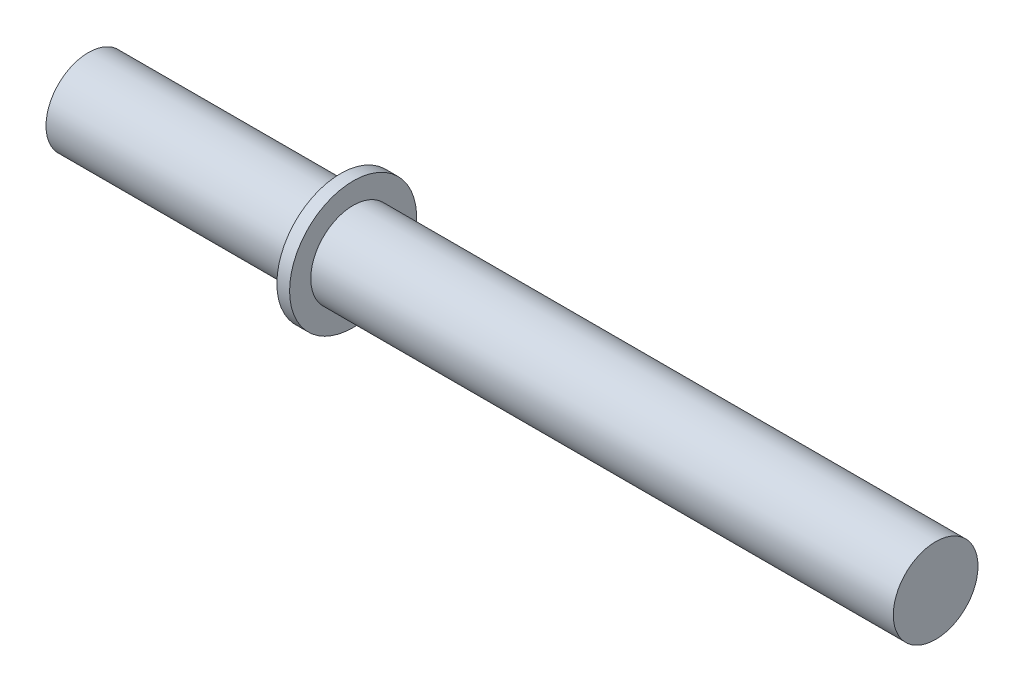
ISO-10303-21;
HEADER;
FILE_DESCRIPTION(('STEP AP214'),'2;1');
FILE_NAME('part.step','',(''),(''),'','','');
FILE_SCHEMA(('AUTOMOTIVE_DESIGN { 1 0 10303 214 1 1 1 1 }'));
ENDSEC;
DATA;
#1=APPLICATION_CONTEXT('core data for automotive mechanical design processes');
#2=APPLICATION_PROTOCOL_DEFINITION('international standard','automotive_design',2000,#1);
#3=PRODUCT_CONTEXT('',#1,'mechanical');
#4=PRODUCT('Part','Part','',(#3));
#5=PRODUCT_RELATED_PRODUCT_CATEGORY('part','',(#4));
#6=PRODUCT_DEFINITION_FORMATION('','',#4);
#7=PRODUCT_DEFINITION_CONTEXT('part definition',#1,'design');
#8=PRODUCT_DEFINITION('design','',#6,#7);
#9=PRODUCT_DEFINITION_SHAPE('','',#8);
#10=(LENGTH_UNIT() NAMED_UNIT(*) SI_UNIT(.MILLI.,.METRE.));
#11=(NAMED_UNIT(*) PLANE_ANGLE_UNIT() SI_UNIT($,.RADIAN.));
#12=(NAMED_UNIT(*) SI_UNIT($,.STERADIAN.) SOLID_ANGLE_UNIT());
#13=UNCERTAINTY_MEASURE_WITH_UNIT(LENGTH_MEASURE(1.E-05),#10,'distance_accuracy_value','');
#14=(GEOMETRIC_REPRESENTATION_CONTEXT(3) GLOBAL_UNCERTAINTY_ASSIGNED_CONTEXT((#13)) GLOBAL_UNIT_ASSIGNED_CONTEXT((#10,
#11,#12)) REPRESENTATION_CONTEXT('',''));
#15=CARTESIAN_POINT('',(0.,0.,0.));
#16=DIRECTION('',(0.,0.,1.));
#17=DIRECTION('',(1.,0.,0.));
#18=AXIS2_PLACEMENT_3D('',#15,#16,#17);
#19=CARTESIAN_POINT('',(200.,0.,0.));
#20=DIRECTION('',(-1.,0.,0.));
#21=DIRECTION('',(0.,0.,1.));
#22=AXIS2_PLACEMENT_3D('',#19,#20,#21);
#23=CYLINDRICAL_SURFACE('',#22,10.);
#24=CARTESIAN_POINT('',(59.5,0.,0.));
#25=DIRECTION('',(-1.,0.,0.));
#26=DIRECTION('',(0.,0.,1.));
#27=AXIS2_PLACEMENT_3D('',#24,#25,#26);
#28=CIRCLE('',#27,10.);
#29=CARTESIAN_POINT('',(59.5,0.,10.));
#30=VERTEX_POINT('',#29);
#31=EDGE_CURVE('E40',#30,#30,#28,.T.);
#32=ORIENTED_EDGE('',*,*,#31,.T.);
#33=EDGE_LOOP('',(#32));
#34=FACE_BOUND('',#33,.T.);
#35=CARTESIAN_POINT('',(0.,0.,0.));
#36=DIRECTION('',(1.,0.,0.));
#37=DIRECTION('',(0.,0.,-1.));
#38=AXIS2_PLACEMENT_3D('',#35,#36,#37);
#39=CIRCLE('',#38,10.);
#40=CARTESIAN_POINT('',(0.,0.,-10.));
#41=VERTEX_POINT('',#40);
#42=EDGE_CURVE('E50',#41,#41,#39,.T.);
#43=ORIENTED_EDGE('',*,*,#42,.T.);
#44=EDGE_LOOP('',(#43));
#45=FACE_BOUND('',#44,.T.);
#46=ADVANCED_FACE('F37',(#34,#45),#23,.T.);
#47=CARTESIAN_POINT('',(0.,0.,0.));
#48=DIRECTION('',(1.,0.,0.));
#49=DIRECTION('',(0.,0.,-1.));
#50=AXIS2_PLACEMENT_3D('',#47,#48,#49);
#51=PLANE('',#50);
#52=ORIENTED_EDGE('',*,*,#42,.F.);
#53=EDGE_LOOP('',(#52));
#54=FACE_BOUND('',#53,.T.);
#55=ADVANCED_FACE('F82',(#54),#51,.F.);
#56=CARTESIAN_POINT('',(59.5,0.,0.));
#57=DIRECTION('',(1.,0.,0.));
#58=DIRECTION('',(0.,0.,-1.));
#59=AXIS2_PLACEMENT_3D('',#56,#57,#58);
#60=CYLINDRICAL_SURFACE('',#59,15.);
#61=CARTESIAN_POINT('',(59.5,0.,0.));
#62=DIRECTION('',(-1.,0.,0.));
#63=DIRECTION('',(0.,0.,1.));
#64=AXIS2_PLACEMENT_3D('',#61,#62,#63);
#65=CIRCLE('',#64,15.);
#66=CARTESIAN_POINT('',(59.5,0.,15.));
#67=VERTEX_POINT('',#66);
#68=EDGE_CURVE('E60',#67,#67,#65,.T.);
#69=ORIENTED_EDGE('',*,*,#68,.F.);
#70=EDGE_LOOP('',(#69));
#71=FACE_BOUND('',#70,.T.);
#72=CARTESIAN_POINT('',(62.5,0.,0.));
#73=DIRECTION('',(-1.,0.,0.));
#74=DIRECTION('',(0.,0.,1.));
#75=AXIS2_PLACEMENT_3D('',#72,#73,#74);
#76=CIRCLE('',#75,15.);
#77=CARTESIAN_POINT('',(62.5,0.,15.));
#78=VERTEX_POINT('',#77);
#79=EDGE_CURVE('E56',#78,#78,#76,.T.);
#80=ORIENTED_EDGE('',*,*,#79,.T.);
#81=EDGE_LOOP('',(#80));
#82=FACE_BOUND('',#81,.T.);
#83=ADVANCED_FACE('F74',(#71,#82),#60,.T.);
#84=CARTESIAN_POINT('',(59.5,0.,0.));
#85=DIRECTION('',(-1.,0.,0.));
#86=DIRECTION('',(0.,0.,1.));
#87=AXIS2_PLACEMENT_3D('',#84,#85,#86);
#88=PLANE('',#87);
#89=ORIENTED_EDGE('',*,*,#31,.F.);
#90=EDGE_LOOP('',(#89));
#91=FACE_BOUND('',#90,.T.);
#92=ORIENTED_EDGE('',*,*,#68,.T.);
#93=EDGE_LOOP('',(#92));
#94=FACE_BOUND('',#93,.T.);
#95=ADVANCED_FACE('F71',(#91,#94),#88,.T.);
#96=CARTESIAN_POINT('',(62.5,0.,0.));
#97=DIRECTION('',(-1.,0.,0.));
#98=DIRECTION('',(0.,0.,1.));
#99=AXIS2_PLACEMENT_3D('',#96,#97,#98);
#100=PLANE('',#99);
#101=CARTESIAN_POINT('',(62.5,0.,0.));
#102=DIRECTION('',(-1.,0.,0.));
#103=DIRECTION('',(0.,0.,1.));
#104=AXIS2_PLACEMENT_3D('',#101,#102,#103);
#105=CIRCLE('',#104,10.);
#106=CARTESIAN_POINT('',(62.5,0.,10.));
#107=VERTEX_POINT('',#106);
#108=EDGE_CURVE('E10',#107,#107,#105,.T.);
#109=ORIENTED_EDGE('',*,*,#108,.T.);
#110=EDGE_LOOP('',(#109));
#111=FACE_BOUND('',#110,.T.);
#112=ORIENTED_EDGE('',*,*,#79,.F.);
#113=EDGE_LOOP('',(#112));
#114=FACE_BOUND('',#113,.T.);
#115=ADVANCED_FACE('F73',(#111,#114),#100,.F.);
#116=CARTESIAN_POINT('',(200.,0.,0.));
#117=DIRECTION('',(1.,0.,0.));
#118=DIRECTION('',(0.,0.,-1.));
#119=AXIS2_PLACEMENT_3D('',#116,#117,#118);
#120=PLANE('',#119);
#121=CARTESIAN_POINT('',(200.,0.,0.));
#122=DIRECTION('',(1.,0.,0.));
#123=DIRECTION('',(0.,0.,-1.));
#124=AXIS2_PLACEMENT_3D('',#121,#122,#123);
#125=CIRCLE('',#124,10.);
#126=CARTESIAN_POINT('',(200.,0.,-10.));
#127=VERTEX_POINT('',#126);
#128=EDGE_CURVE('E45',#127,#127,#125,.T.);
#129=ORIENTED_EDGE('',*,*,#128,.T.);
#130=EDGE_LOOP('',(#129));
#131=FACE_BOUND('',#130,.T.);
#132=ADVANCED_FACE('F80',(#131),#120,.T.);
#133=ORIENTED_EDGE('',*,*,#128,.F.);
#134=EDGE_LOOP('',(#133));
#135=FACE_BOUND('',#134,.T.);
#136=ORIENTED_EDGE('',*,*,#108,.F.);
#137=EDGE_LOOP('',(#136));
#138=FACE_BOUND('',#137,.T.);
#139=ADVANCED_FACE('F86',(#135,#138),#23,.T.);
#140=CLOSED_SHELL('',(#46,#55,#83,#95,#115,#132,#139));
#141=MANIFOLD_SOLID_BREP('B2',#140);
#142=ADVANCED_BREP_SHAPE_REPRESENTATION('',(#18,#141),#14);
#143=SHAPE_DEFINITION_REPRESENTATION(#9,#142);
ENDSEC;
END-ISO-10303-21;
